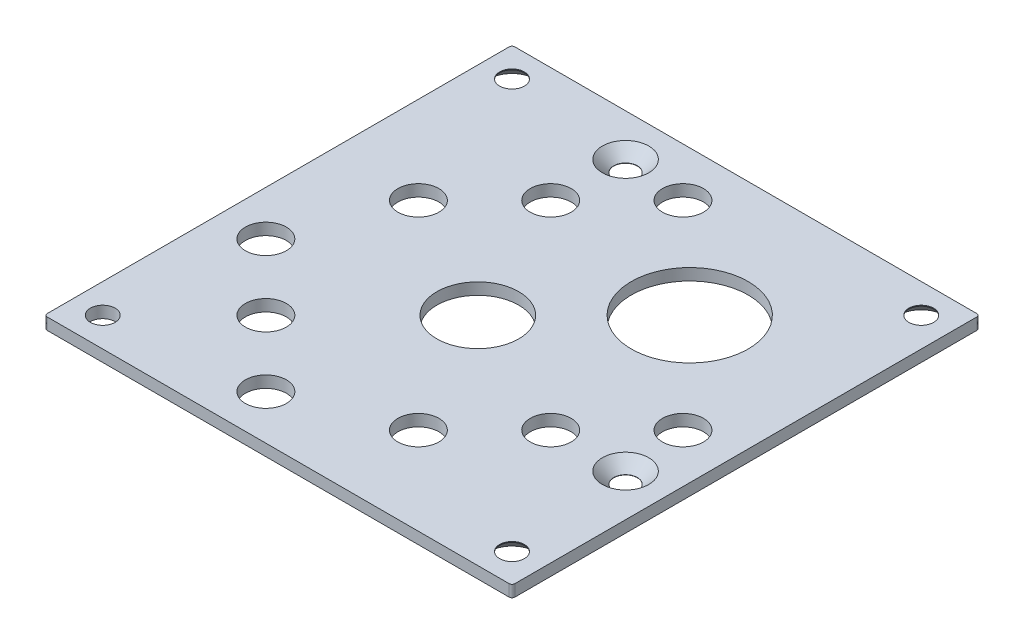
ISO-10303-21;
HEADER;
FILE_DESCRIPTION(('STEP AP214'),'2;1');
FILE_NAME('part.step','',(''),(''),'','','');
FILE_SCHEMA(('AUTOMOTIVE_DESIGN { 1 0 10303 214 1 1 1 1 }'));
ENDSEC;
DATA;
#1=APPLICATION_CONTEXT('core data for automotive mechanical design processes');
#2=APPLICATION_PROTOCOL_DEFINITION('international standard','automotive_design',2000,#1);
#3=PRODUCT_CONTEXT('',#1,'mechanical');
#4=PRODUCT('Part','Part','',(#3));
#5=PRODUCT_RELATED_PRODUCT_CATEGORY('part','',(#4));
#6=PRODUCT_DEFINITION_FORMATION('','',#4);
#7=PRODUCT_DEFINITION_CONTEXT('part definition',#1,'design');
#8=PRODUCT_DEFINITION('design','',#6,#7);
#9=PRODUCT_DEFINITION_SHAPE('','',#8);
#10=(LENGTH_UNIT() NAMED_UNIT(*) SI_UNIT(.MILLI.,.METRE.));
#11=(NAMED_UNIT(*) PLANE_ANGLE_UNIT() SI_UNIT($,.RADIAN.));
#12=(NAMED_UNIT(*) SI_UNIT($,.STERADIAN.) SOLID_ANGLE_UNIT());
#13=UNCERTAINTY_MEASURE_WITH_UNIT(LENGTH_MEASURE(1.E-05),#10,'distance_accuracy_value','');
#14=(GEOMETRIC_REPRESENTATION_CONTEXT(3) GLOBAL_UNCERTAINTY_ASSIGNED_CONTEXT((#13)) GLOBAL_UNIT_ASSIGNED_CONTEXT((#10,
#11,#12)) REPRESENTATION_CONTEXT('',''));
#15=CARTESIAN_POINT('',(0.,0.,0.));
#16=DIRECTION('',(0.,0.,1.));
#17=DIRECTION('',(1.,0.,0.));
#18=AXIS2_PLACEMENT_3D('',#15,#16,#17);
#19=CARTESIAN_POINT('',(76.3793482367758,0.,47.8960232997482));
#20=DIRECTION('',(0.,-1.,0.));
#21=DIRECTION('',(0.,0.,-1.));
#22=AXIS2_PLACEMENT_3D('',#19,#20,#21);
#23=CYLINDRICAL_SURFACE('',#22,0.793749999999989);
#24=CARTESIAN_POINT('',(76.3793482367758,0.,47.8960232997482));
#25=DIRECTION('',(0.,-1.,0.));
#26=DIRECTION('',(0.,0.,-1.));
#27=AXIS2_PLACEMENT_3D('',#24,#25,#26);
#28=CIRCLE('',#27,0.793749999999989);
#29=CARTESIAN_POINT('',(77.1730982367758,0.,47.8960232997482));
#30=VERTEX_POINT('',#29);
#31=CARTESIAN_POINT('',(76.3793482367758,0.,48.6897732997481));
#32=VERTEX_POINT('',#31);
#33=EDGE_CURVE('E104',#30,#32,#28,.T.);
#34=ORIENTED_EDGE('',*,*,#33,.T.);
#35=DIRECTION('',(0.,1.,0.));
#36=VECTOR('',#35,1.);
#37=CARTESIAN_POINT('',(76.3793482367758,0.,48.6897732997481));
#38=LINE('',#37,#36);
#39=CARTESIAN_POINT('',(76.3793482367758,-3.175,48.6897732997481));
#40=VERTEX_POINT('',#39);
#41=EDGE_CURVE('E139',#40,#32,#38,.T.);
#42=ORIENTED_EDGE('',*,*,#41,.F.);
#43=CARTESIAN_POINT('',(76.3793482367758,-3.175,47.8960232997482));
#44=DIRECTION('',(0.,-1.,0.));
#45=DIRECTION('',(0.,0.,-1.));
#46=AXIS2_PLACEMENT_3D('',#43,#44,#45);
#47=CIRCLE('',#46,0.793749999999989);
#48=CARTESIAN_POINT('',(77.1730982367758,-3.175,47.8960232997482));
#49=VERTEX_POINT('',#48);
#50=EDGE_CURVE('E39',#40,#49,#47,.F.);
#51=ORIENTED_EDGE('',*,*,#50,.T.);
#52=DIRECTION('',(0.,1.,0.));
#53=VECTOR('',#52,1.);
#54=CARTESIAN_POINT('',(77.1730982367758,0.,47.8960232997482));
#55=LINE('',#54,#53);
#56=EDGE_CURVE('E125',#30,#49,#55,.F.);
#57=ORIENTED_EDGE('',*,*,#56,.F.);
#58=EDGE_LOOP('',(#34,#42,#51,#57));
#59=FACE_BOUND('',#58,.T.);
#60=ADVANCED_FACE('F36',(#59),#23,.T.);
#61=CARTESIAN_POINT('',(-49.0331517632242,0.,47.8960232997481));
#62=DIRECTION('',(0.,-1.,0.));
#63=DIRECTION('',(0.,0.,-1.));
#64=AXIS2_PLACEMENT_3D('',#61,#62,#63);
#65=CYLINDRICAL_SURFACE('',#64,0.793750000000003);
#66=CARTESIAN_POINT('',(-49.0331517632242,0.,47.8960232997481));
#67=DIRECTION('',(0.,-1.,0.));
#68=DIRECTION('',(0.,0.,-1.));
#69=AXIS2_PLACEMENT_3D('',#66,#67,#68);
#70=CIRCLE('',#69,0.793750000000003);
#71=CARTESIAN_POINT('',(-49.0331517632242,0.,48.6897732997481));
#72=VERTEX_POINT('',#71);
#73=CARTESIAN_POINT('',(-49.8269017632242,0.,47.8960232997481));
#74=VERTEX_POINT('',#73);
#75=EDGE_CURVE('E224',#72,#74,#70,.T.);
#76=ORIENTED_EDGE('',*,*,#75,.T.);
#77=DIRECTION('',(0.,1.,0.));
#78=VECTOR('',#77,1.);
#79=CARTESIAN_POINT('',(-49.8269017632242,0.,47.8960232997481));
#80=LINE('',#79,#78);
#81=CARTESIAN_POINT('',(-49.8269017632242,-3.175,47.8960232997481));
#82=VERTEX_POINT('',#81);
#83=EDGE_CURVE('E147',#82,#74,#80,.T.);
#84=ORIENTED_EDGE('',*,*,#83,.F.);
#85=CARTESIAN_POINT('',(-49.0331517632242,-3.175,47.8960232997481));
#86=DIRECTION('',(0.,-1.,0.));
#87=DIRECTION('',(0.,0.,-1.));
#88=AXIS2_PLACEMENT_3D('',#85,#86,#87);
#89=CIRCLE('',#88,0.793750000000003);
#90=CARTESIAN_POINT('',(-49.0331517632242,-3.175,48.6897732997481));
#91=VERTEX_POINT('',#90);
#92=EDGE_CURVE('E227',#82,#91,#89,.F.);
#93=ORIENTED_EDGE('',*,*,#92,.T.);
#94=DIRECTION('',(0.,1.,0.));
#95=VECTOR('',#94,1.);
#96=CARTESIAN_POINT('',(-49.0331517632242,0.,48.6897732997481));
#97=LINE('',#96,#95);
#98=EDGE_CURVE('E136',#72,#91,#97,.F.);
#99=ORIENTED_EDGE('',*,*,#98,.F.);
#100=EDGE_LOOP('',(#76,#84,#93,#99));
#101=FACE_BOUND('',#100,.T.);
#102=ADVANCED_FACE('F258',(#101),#65,.T.);
#103=CARTESIAN_POINT('',(-49.0331517632242,0.,-77.5164767002519));
#104=DIRECTION('',(0.,-1.,0.));
#105=DIRECTION('',(0.,0.,-1.));
#106=AXIS2_PLACEMENT_3D('',#103,#104,#105);
#107=CYLINDRICAL_SURFACE('',#106,0.793749999999996);
#108=CARTESIAN_POINT('',(-49.0331517632242,0.,-77.5164767002519));
#109=DIRECTION('',(0.,-1.,0.));
#110=DIRECTION('',(0.,0.,-1.));
#111=AXIS2_PLACEMENT_3D('',#108,#109,#110);
#112=CIRCLE('',#111,0.793749999999996);
#113=CARTESIAN_POINT('',(-49.8269017632242,0.,-77.5164767002519));
#114=VERTEX_POINT('',#113);
#115=CARTESIAN_POINT('',(-49.0331517632242,0.,-78.3102267002519));
#116=VERTEX_POINT('',#115);
#117=EDGE_CURVE('E222',#114,#116,#112,.T.);
#118=ORIENTED_EDGE('',*,*,#117,.T.);
#119=DIRECTION('',(0.,1.,0.));
#120=VECTOR('',#119,1.);
#121=CARTESIAN_POINT('',(-49.0331517632242,0.,-78.3102267002519));
#122=LINE('',#121,#120);
#123=CARTESIAN_POINT('',(-49.0331517632242,-3.175,-78.3102267002519));
#124=VERTEX_POINT('',#123);
#125=EDGE_CURVE('E142',#124,#116,#122,.T.);
#126=ORIENTED_EDGE('',*,*,#125,.F.);
#127=CARTESIAN_POINT('',(-49.0331517632242,-3.175,-77.5164767002519));
#128=DIRECTION('',(0.,-1.,0.));
#129=DIRECTION('',(0.,0.,-1.));
#130=AXIS2_PLACEMENT_3D('',#127,#128,#129);
#131=CIRCLE('',#130,0.793749999999996);
#132=CARTESIAN_POINT('',(-49.8269017632242,-3.175,-77.5164767002519));
#133=VERTEX_POINT('',#132);
#134=EDGE_CURVE('E53',#124,#133,#131,.F.);
#135=ORIENTED_EDGE('',*,*,#134,.T.);
#136=DIRECTION('',(0.,1.,0.));
#137=VECTOR('',#136,1.);
#138=CARTESIAN_POINT('',(-49.8269017632242,0.,-77.5164767002519));
#139=LINE('',#138,#137);
#140=EDGE_CURVE('E146',#114,#133,#139,.F.);
#141=ORIENTED_EDGE('',*,*,#140,.F.);
#142=EDGE_LOOP('',(#118,#126,#135,#141));
#143=FACE_BOUND('',#142,.T.);
#144=ADVANCED_FACE('F266',(#143),#107,.T.);
#145=CARTESIAN_POINT('',(76.3793482367758,0.,-77.5164767002519));
#146=DIRECTION('',(0.,-1.,0.));
#147=DIRECTION('',(0.,0.,-1.));
#148=AXIS2_PLACEMENT_3D('',#145,#146,#147);
#149=PLANE('',#148);
#150=CARTESIAN_POINT('',(65.7430982367758,0.,6.42147017462234));
#151=DIRECTION('',(0.,1.,0.));
#152=DIRECTION('',(0.,0.,1.));
#153=AXIS2_PLACEMENT_3D('',#150,#151,#152);
#154=CIRCLE('',#153,6.3);
#155=CARTESIAN_POINT('',(65.7430982367758,0.,12.7214701746223));
#156=VERTEX_POINT('',#155);
#157=EDGE_CURVE('E410',#156,#156,#154,.T.);
#158=ORIENTED_EDGE('',*,*,#157,.F.);
#159=EDGE_LOOP('',(#158));
#160=FACE_BOUND('',#159,.T.);
#161=CARTESIAN_POINT('',(-7.55859863809813,0.,-66.8802267002519));
#162=DIRECTION('',(0.,1.,0.));
#163=DIRECTION('',(0.,0.,1.));
#164=AXIS2_PLACEMENT_3D('',#161,#162,#163);
#165=CIRCLE('',#164,6.3);
#166=CARTESIAN_POINT('',(-7.55859863809813,0.,-60.5802267002519));
#167=VERTEX_POINT('',#166);
#168=EDGE_CURVE('E419',#167,#167,#165,.T.);
#169=ORIENTED_EDGE('',*,*,#168,.F.);
#170=EDGE_LOOP('',(#169));
#171=FACE_BOUND('',#170,.T.);
#172=CARTESIAN_POINT('',(37.8030982367758,0.,-38.9402267002519));
#173=DIRECTION('',(0.,-1.,0.));
#174=DIRECTION('',(0.,0.,-1.));
#175=AXIS2_PLACEMENT_3D('',#172,#173,#174);
#176=CIRCLE('',#175,15.875);
#177=CARTESIAN_POINT('',(37.8030982367758,0.,-54.8152267002519));
#178=VERTEX_POINT('',#177);
#179=EDGE_CURVE('E232',#178,#178,#176,.F.);
#180=ORIENTED_EDGE('',*,*,#179,.F.);
#181=EDGE_LOOP('',(#180));
#182=FACE_BOUND('',#181,.T.);
#183=DIRECTION('',(-1.,0.,0.));
#184=VECTOR('',#183,1.);
#185=CARTESIAN_POINT('',(-49.0331517632242,0.,-78.3102267002519));
#186=LINE('',#185,#184);
#187=CARTESIAN_POINT('',(76.3793482367758,0.,-78.3102267002519));
#188=VERTEX_POINT('',#187);
#189=EDGE_CURVE('E140',#116,#188,#186,.F.);
#190=ORIENTED_EDGE('',*,*,#189,.F.);
#191=ORIENTED_EDGE('',*,*,#117,.F.);
#192=DIRECTION('',(0.,0.,1.));
#193=VECTOR('',#192,1.);
#194=CARTESIAN_POINT('',(-49.8269017632242,0.,47.8960232997481));
#195=LINE('',#194,#193);
#196=EDGE_CURVE('E143',#74,#114,#195,.F.);
#197=ORIENTED_EDGE('',*,*,#196,.F.);
#198=ORIENTED_EDGE('',*,*,#75,.F.);
#199=DIRECTION('',(1.,0.,0.));
#200=VECTOR('',#199,1.);
#201=CARTESIAN_POINT('',(76.3793482367758,0.,48.6897732997481));
#202=LINE('',#201,#200);
#203=EDGE_CURVE('E148',#32,#72,#202,.F.);
#204=ORIENTED_EDGE('',*,*,#203,.F.);
#205=ORIENTED_EDGE('',*,*,#33,.F.);
#206=DIRECTION('',(0.,0.,-1.));
#207=VECTOR('',#206,1.);
#208=CARTESIAN_POINT('',(77.1730982367758,0.,-77.5164767002519));
#209=LINE('',#208,#207);
#210=CARTESIAN_POINT('',(77.1730982367758,0.,-77.5164767002519));
#211=VERTEX_POINT('',#210);
#212=EDGE_CURVE('E121',#211,#30,#209,.F.);
#213=ORIENTED_EDGE('',*,*,#212,.F.);
#214=CARTESIAN_POINT('',(76.3793482367758,0.,-77.5164767002519));
#215=DIRECTION('',(0.,-1.,0.));
#216=DIRECTION('',(0.,0.,-1.));
#217=AXIS2_PLACEMENT_3D('',#214,#215,#216);
#218=CIRCLE('',#217,0.79375000000001);
#219=EDGE_CURVE('E109',#188,#211,#218,.T.);
#220=ORIENTED_EDGE('',*,*,#219,.F.);
#221=EDGE_LOOP('',(#190,#191,#197,#198,#204,#205,#213,#220));
#222=FACE_BOUND('',#221,.T.);
#223=CARTESIAN_POINT('',(9.86980299882452,0.,-65.0415496895075));
#224=DIRECTION('',(0.,-1.,0.));
#225=DIRECTION('',(0.,0.,-1.));
#226=AXIS2_PLACEMENT_3D('',#223,#224,#225);
#227=CIRCLE('',#226,5.56259999999954);
#228=CARTESIAN_POINT('',(9.86980299882452,0.,-70.6041496895071));
#229=VERTEX_POINT('',#228);
#230=EDGE_CURVE('E129',#229,#229,#227,.T.);
#231=ORIENTED_EDGE('',*,*,#230,.T.);
#232=EDGE_LOOP('',(#231));
#233=FACE_BOUND('',#232,.T.);
#234=CARTESIAN_POINT('',(27.9833967417508,0.,24.9140930219768));
#235=DIRECTION('',(0.,-1.,0.));
#236=DIRECTION('',(0.,0.,-1.));
#237=AXIS2_PLACEMENT_3D('',#234,#235,#236);
#238=CIRCLE('',#237,5.56260000000157);
#239=CARTESIAN_POINT('',(27.9833967417508,0.,19.3514930219753));
#240=VERTEX_POINT('',#239);
#241=EDGE_CURVE('E132',#240,#240,#238,.T.);
#242=ORIENTED_EDGE('',*,*,#241,.T.);
#243=EDGE_LOOP('',(#242));
#244=FACE_BOUND('',#243,.T.);
#245=CARTESIAN_POINT('',(-8.09070924331382,0.,-47.0810374473692));
#246=DIRECTION('',(0.,-1.,0.));
#247=DIRECTION('',(0.,0.,-1.));
#248=AXIS2_PLACEMENT_3D('',#245,#246,#247);
#249=CIRCLE('',#248,5.56259999999954);
#250=CARTESIAN_POINT('',(-8.09070924331382,0.,-52.6436374473688));
#251=VERTEX_POINT('',#250);
#252=EDGE_CURVE('E186',#251,#251,#249,.T.);
#253=ORIENTED_EDGE('',*,*,#252,.T.);
#254=EDGE_LOOP('',(#253));
#255=FACE_BOUND('',#254,.T.);
#256=CARTESIAN_POINT('',(-41.8894017632242,0.,-70.3727267002519));
#257=DIRECTION('',(0.,-1.,0.));
#258=DIRECTION('',(0.,0.,-1.));
#259=AXIS2_PLACEMENT_3D('',#256,#257,#258);
#260=CIRCLE('',#259,3.3528);
#261=CARTESIAN_POINT('',(-41.8894017632242,0.,-73.7255267002519));
#262=VERTEX_POINT('',#261);
#263=EDGE_CURVE('E189',#262,#262,#260,.T.);
#264=ORIENTED_EDGE('',*,*,#263,.T.);
#265=EDGE_LOOP('',(#264));
#266=FACE_BOUND('',#265,.T.);
#267=CARTESIAN_POINT('',(69.2355982367758,0.,40.7522732997481));
#268=DIRECTION('',(0.,-1.,0.));
#269=DIRECTION('',(0.,0.,-1.));
#270=AXIS2_PLACEMENT_3D('',#267,#268,#269);
#271=CIRCLE('',#270,3.3528);
#272=CARTESIAN_POINT('',(69.2355982367758,0.,37.3994732997481));
#273=VERTEX_POINT('',#272);
#274=EDGE_CURVE('E192',#273,#273,#271,.T.);
#275=ORIENTED_EDGE('',*,*,#274,.T.);
#276=EDGE_LOOP('',(#275));
#277=FACE_BOUND('',#276,.T.);
#278=CARTESIAN_POINT('',(69.2355982367759,0.,-70.3727267002519));
#279=DIRECTION('',(0.,-1.,0.));
#280=DIRECTION('',(0.,0.,-1.));
#281=AXIS2_PLACEMENT_3D('',#278,#279,#280);
#282=CIRCLE('',#281,3.3528);
#283=CARTESIAN_POINT('',(69.2355982367759,0.,-73.7255267002519));
#284=VERTEX_POINT('',#283);
#285=EDGE_CURVE('E195',#284,#284,#282,.T.);
#286=ORIENTED_EDGE('',*,*,#285,.T.);
#287=EDGE_LOOP('',(#286));
#288=FACE_BOUND('',#287,.T.);
#289=CARTESIAN_POINT('',(9.03035762487018,0.,-10.1674860883464));
#290=DIRECTION('',(0.,-1.,0.));
#291=DIRECTION('',(0.,0.,-1.));
#292=AXIS2_PLACEMENT_3D('',#289,#290,#291);
#293=CIRCLE('',#292,11.1125);
#294=CARTESIAN_POINT('',(9.03035762487018,0.,-21.2799860883464));
#295=VERTEX_POINT('',#294);
#296=EDGE_CURVE('E198',#295,#295,#293,.T.);
#297=ORIENTED_EDGE('',*,*,#296,.T.);
#298=EDGE_LOOP('',(#297));
#299=FACE_BOUND('',#298,.T.);
#300=CARTESIAN_POINT('',(-41.8894017632242,0.,40.7522732997481));
#301=DIRECTION('',(0.,-1.,0.));
#302=DIRECTION('',(0.,0.,-1.));
#303=AXIS2_PLACEMENT_3D('',#300,#301,#302);
#304=CIRCLE('',#303,3.3528);
#305=CARTESIAN_POINT('',(-41.8894017632242,0.,37.3994732997481));
#306=VERTEX_POINT('',#305);
#307=EDGE_CURVE('E201',#306,#306,#304,.T.);
#308=ORIENTED_EDGE('',*,*,#307,.T.);
#309=EDGE_LOOP('',(#308));
#310=FACE_BOUND('',#309,.T.);
#311=CARTESIAN_POINT('',(-26.0512214854522,0.,-29.120525205231));
#312=DIRECTION('',(0.,-1.,0.));
#313=DIRECTION('',(0.,0.,-1.));
#314=AXIS2_PLACEMENT_3D('',#311,#312,#313);
#315=CIRCLE('',#314,5.56259999999954);
#316=CARTESIAN_POINT('',(-26.0512214854522,0.,-34.6831252052305));
#317=VERTEX_POINT('',#316);
#318=EDGE_CURVE('E204',#317,#317,#315,.T.);
#319=ORIENTED_EDGE('',*,*,#318,.T.);
#320=EDGE_LOOP('',(#319));
#321=FACE_BOUND('',#320,.T.);
#322=CARTESIAN_POINT('',(63.904421226029,0.,-11.0069314622982));
#323=DIRECTION('',(0.,-1.,0.));
#324=DIRECTION('',(0.,0.,-1.));
#325=AXIS2_PLACEMENT_3D('',#322,#323,#324);
#326=CIRCLE('',#325,5.5626);
#327=CARTESIAN_POINT('',(63.904421226029,0.,-16.5695314622982));
#328=VERTEX_POINT('',#327);
#329=EDGE_CURVE('E207',#328,#328,#326,.T.);
#330=ORIENTED_EDGE('',*,*,#329,.T.);
#331=EDGE_LOOP('',(#330));
#332=FACE_BOUND('',#331,.T.);
#333=CARTESIAN_POINT('',(45.9439089838899,0.,6.95358077983932));
#334=DIRECTION('',(0.,-1.,0.));
#335=DIRECTION('',(0.,0.,-1.));
#336=AXIS2_PLACEMENT_3D('',#333,#334,#335);
#337=CIRCLE('',#336,5.56260000000102);
#338=CARTESIAN_POINT('',(45.9439089838899,0.,1.3909807798383));
#339=VERTEX_POINT('',#338);
#340=EDGE_CURVE('E210',#339,#339,#337,.T.);
#341=ORIENTED_EDGE('',*,*,#340,.T.);
#342=EDGE_LOOP('',(#341));
#343=FACE_BOUND('',#342,.T.);
#344=CARTESIAN_POINT('',(-19.7423829870354,0.,18.6052545235591));
#345=DIRECTION('',(0.,-1.,0.));
#346=DIRECTION('',(0.,0.,-1.));
#347=AXIS2_PLACEMENT_3D('',#344,#345,#346);
#348=CIRCLE('',#347,5.5626);
#349=CARTESIAN_POINT('',(-19.7423829870354,0.,13.0426545235591));
#350=VERTEX_POINT('',#349);
#351=EDGE_CURVE('E213',#350,#350,#348,.T.);
#352=ORIENTED_EDGE('',*,*,#351,.T.);
#353=EDGE_LOOP('',(#352));
#354=FACE_BOUND('',#353,.T.);
#355=CARTESIAN_POINT('',(-1.78187074489717,0.,36.5657667656975));
#356=DIRECTION('',(0.,-1.,0.));
#357=DIRECTION('',(0.,0.,-1.));
#358=AXIS2_PLACEMENT_3D('',#355,#356,#357);
#359=CIRCLE('',#358,5.56259999999999);
#360=CARTESIAN_POINT('',(-1.78187074489717,0.,31.0031667656975));
#361=VERTEX_POINT('',#360);
#362=EDGE_CURVE('E216',#361,#361,#359,.T.);
#363=ORIENTED_EDGE('',*,*,#362,.T.);
#364=EDGE_LOOP('',(#363));
#365=FACE_BOUND('',#364,.T.);
#366=CARTESIAN_POINT('',(-37.7028952291737,0.,0.644742281420776));
#367=DIRECTION('',(0.,-1.,0.));
#368=DIRECTION('',(0.,0.,-1.));
#369=AXIS2_PLACEMENT_3D('',#366,#367,#368);
#370=CIRCLE('',#369,5.56260000000001);
#371=CARTESIAN_POINT('',(-37.7028952291737,0.,-4.91785771857923));
#372=VERTEX_POINT('',#371);
#373=EDGE_CURVE('E118',#372,#372,#370,.T.);
#374=ORIENTED_EDGE('',*,*,#373,.T.);
#375=EDGE_LOOP('',(#374));
#376=FACE_BOUND('',#375,.T.);
#377=ADVANCED_FACE('F122',(#160,#171,#182,#222,#233,#244,#255,#266,#277,#288,#299,#310,#321,
#332,#343,#354,#365,#376),#149,.F.);
#378=CARTESIAN_POINT('',(76.3793482367758,0.,-77.5164767002519));
#379=DIRECTION('',(0.,-1.,0.));
#380=DIRECTION('',(0.,0.,-1.));
#381=AXIS2_PLACEMENT_3D('',#378,#379,#380);
#382=CYLINDRICAL_SURFACE('',#381,0.79375000000001);
#383=ORIENTED_EDGE('',*,*,#219,.T.);
#384=DIRECTION('',(0.,1.,0.));
#385=VECTOR('',#384,1.);
#386=CARTESIAN_POINT('',(77.1730982367758,0.,-77.5164767002519));
#387=LINE('',#386,#385);
#388=CARTESIAN_POINT('',(77.1730982367758,-3.175,-77.5164767002519));
#389=VERTEX_POINT('',#388);
#390=EDGE_CURVE('E112',#389,#211,#387,.T.);
#391=ORIENTED_EDGE('',*,*,#390,.F.);
#392=CARTESIAN_POINT('',(76.3793482367758,-3.175,-77.5164767002519));
#393=DIRECTION('',(0.,-1.,0.));
#394=DIRECTION('',(0.,0.,-1.));
#395=AXIS2_PLACEMENT_3D('',#392,#393,#394);
#396=CIRCLE('',#395,0.79375000000001);
#397=CARTESIAN_POINT('',(76.3793482367758,-3.175,-78.3102267002519));
#398=VERTEX_POINT('',#397);
#399=EDGE_CURVE('E79',#389,#398,#396,.F.);
#400=ORIENTED_EDGE('',*,*,#399,.T.);
#401=DIRECTION('',(0.,1.,0.));
#402=VECTOR('',#401,1.);
#403=CARTESIAN_POINT('',(76.3793482367758,0.,-78.3102267002519));
#404=LINE('',#403,#402);
#405=EDGE_CURVE('E115',#188,#398,#404,.F.);
#406=ORIENTED_EDGE('',*,*,#405,.F.);
#407=EDGE_LOOP('',(#383,#391,#400,#406));
#408=FACE_BOUND('',#407,.T.);
#409=ADVANCED_FACE('F110',(#408),#382,.T.);
#410=CARTESIAN_POINT('',(-37.7028952291737,0.,0.644742281420776));
#411=DIRECTION('',(0.,-1.,0.));
#412=DIRECTION('',(0.,0.,-1.));
#413=AXIS2_PLACEMENT_3D('',#410,#411,#412);
#414=CYLINDRICAL_SURFACE('',#413,5.56260000000001);
#415=CARTESIAN_POINT('',(-37.7028952291737,-3.175,0.644742281420776));
#416=DIRECTION('',(0.,-1.,0.));
#417=DIRECTION('',(0.,0.,-1.));
#418=AXIS2_PLACEMENT_3D('',#415,#416,#417);
#419=CIRCLE('',#418,5.56260000000001);
#420=CARTESIAN_POINT('',(-37.7028952291737,-3.175,-4.91785771857923));
#421=VERTEX_POINT('',#420);
#422=EDGE_CURVE('E181',#421,#421,#419,.F.);
#423=ORIENTED_EDGE('',*,*,#422,.F.);
#424=EDGE_LOOP('',(#423));
#425=FACE_BOUND('',#424,.T.);
#426=ORIENTED_EDGE('',*,*,#373,.F.);
#427=EDGE_LOOP('',(#426));
#428=FACE_BOUND('',#427,.T.);
#429=ADVANCED_FACE('F337',(#425,#428),#414,.F.);
#430=CARTESIAN_POINT('',(-1.78187074489717,0.,36.5657667656975));
#431=DIRECTION('',(0.,-1.,0.));
#432=DIRECTION('',(0.,0.,-1.));
#433=AXIS2_PLACEMENT_3D('',#430,#431,#432);
#434=CYLINDRICAL_SURFACE('',#433,5.56259999999999);
#435=CARTESIAN_POINT('',(-1.78187074489717,-3.175,36.5657667656975));
#436=DIRECTION('',(0.,-1.,0.));
#437=DIRECTION('',(0.,0.,-1.));
#438=AXIS2_PLACEMENT_3D('',#435,#436,#437);
#439=CIRCLE('',#438,5.56259999999999);
#440=CARTESIAN_POINT('',(-1.78187074489717,-3.175,31.0031667656975));
#441=VERTEX_POINT('',#440);
#442=EDGE_CURVE('E178',#441,#441,#439,.F.);
#443=ORIENTED_EDGE('',*,*,#442,.F.);
#444=EDGE_LOOP('',(#443));
#445=FACE_BOUND('',#444,.T.);
#446=ORIENTED_EDGE('',*,*,#362,.F.);
#447=EDGE_LOOP('',(#446));
#448=FACE_BOUND('',#447,.T.);
#449=ADVANCED_FACE('F333',(#445,#448),#434,.F.);
#450=CARTESIAN_POINT('',(-19.7423829870354,0.,18.6052545235591));
#451=DIRECTION('',(0.,-1.,0.));
#452=DIRECTION('',(0.,0.,-1.));
#453=AXIS2_PLACEMENT_3D('',#450,#451,#452);
#454=CYLINDRICAL_SURFACE('',#453,5.5626);
#455=CARTESIAN_POINT('',(-19.7423829870354,-3.175,18.6052545235591));
#456=DIRECTION('',(0.,-1.,0.));
#457=DIRECTION('',(0.,0.,-1.));
#458=AXIS2_PLACEMENT_3D('',#455,#456,#457);
#459=CIRCLE('',#458,5.5626);
#460=CARTESIAN_POINT('',(-19.7423829870354,-3.175,13.0426545235591));
#461=VERTEX_POINT('',#460);
#462=EDGE_CURVE('E175',#461,#461,#459,.F.);
#463=ORIENTED_EDGE('',*,*,#462,.F.);
#464=EDGE_LOOP('',(#463));
#465=FACE_BOUND('',#464,.T.);
#466=ORIENTED_EDGE('',*,*,#351,.F.);
#467=EDGE_LOOP('',(#466));
#468=FACE_BOUND('',#467,.T.);
#469=ADVANCED_FACE('F329',(#465,#468),#454,.F.);
#470=CARTESIAN_POINT('',(45.9439089838899,0.,6.95358077983932));
#471=DIRECTION('',(0.,-1.,0.));
#472=DIRECTION('',(0.,0.,-1.));
#473=AXIS2_PLACEMENT_3D('',#470,#471,#472);
#474=CYLINDRICAL_SURFACE('',#473,5.56260000000102);
#475=CARTESIAN_POINT('',(45.9439089838899,-3.175,6.95358077983932));
#476=DIRECTION('',(0.,-1.,0.));
#477=DIRECTION('',(0.,0.,-1.));
#478=AXIS2_PLACEMENT_3D('',#475,#476,#477);
#479=CIRCLE('',#478,5.56260000000102);
#480=CARTESIAN_POINT('',(45.9439089838899,-3.175,1.3909807798383));
#481=VERTEX_POINT('',#480);
#482=EDGE_CURVE('E172',#481,#481,#479,.F.);
#483=ORIENTED_EDGE('',*,*,#482,.F.);
#484=EDGE_LOOP('',(#483));
#485=FACE_BOUND('',#484,.T.);
#486=ORIENTED_EDGE('',*,*,#340,.F.);
#487=EDGE_LOOP('',(#486));
#488=FACE_BOUND('',#487,.T.);
#489=ADVANCED_FACE('F325',(#485,#488),#474,.F.);
#490=CARTESIAN_POINT('',(63.904421226029,0.,-11.0069314622982));
#491=DIRECTION('',(0.,-1.,0.));
#492=DIRECTION('',(0.,0.,-1.));
#493=AXIS2_PLACEMENT_3D('',#490,#491,#492);
#494=CYLINDRICAL_SURFACE('',#493,5.5626);
#495=CARTESIAN_POINT('',(63.904421226029,-3.175,-11.0069314622982));
#496=DIRECTION('',(0.,-1.,0.));
#497=DIRECTION('',(0.,0.,-1.));
#498=AXIS2_PLACEMENT_3D('',#495,#496,#497);
#499=CIRCLE('',#498,5.5626);
#500=CARTESIAN_POINT('',(63.904421226029,-3.175,-16.5695314622982));
#501=VERTEX_POINT('',#500);
#502=EDGE_CURVE('E169',#501,#501,#499,.F.);
#503=ORIENTED_EDGE('',*,*,#502,.F.);
#504=EDGE_LOOP('',(#503));
#505=FACE_BOUND('',#504,.T.);
#506=ORIENTED_EDGE('',*,*,#329,.F.);
#507=EDGE_LOOP('',(#506));
#508=FACE_BOUND('',#507,.T.);
#509=ADVANCED_FACE('F321',(#505,#508),#494,.F.);
#510=CARTESIAN_POINT('',(-26.0512214854522,0.,-29.120525205231));
#511=DIRECTION('',(0.,-1.,0.));
#512=DIRECTION('',(0.,0.,-1.));
#513=AXIS2_PLACEMENT_3D('',#510,#511,#512);
#514=CYLINDRICAL_SURFACE('',#513,5.56259999999954);
#515=CARTESIAN_POINT('',(-26.0512214854522,-3.175,-29.120525205231));
#516=DIRECTION('',(0.,-1.,0.));
#517=DIRECTION('',(0.,0.,-1.));
#518=AXIS2_PLACEMENT_3D('',#515,#516,#517);
#519=CIRCLE('',#518,5.56259999999954);
#520=CARTESIAN_POINT('',(-26.0512214854522,-3.175,-34.6831252052305));
#521=VERTEX_POINT('',#520);
#522=EDGE_CURVE('E166',#521,#521,#519,.F.);
#523=ORIENTED_EDGE('',*,*,#522,.F.);
#524=EDGE_LOOP('',(#523));
#525=FACE_BOUND('',#524,.T.);
#526=ORIENTED_EDGE('',*,*,#318,.F.);
#527=EDGE_LOOP('',(#526));
#528=FACE_BOUND('',#527,.T.);
#529=ADVANCED_FACE('F317',(#525,#528),#514,.F.);
#530=CARTESIAN_POINT('',(-41.8894017632242,0.,40.7522732997481));
#531=DIRECTION('',(0.,-1.,0.));
#532=DIRECTION('',(0.,0.,-1.));
#533=AXIS2_PLACEMENT_3D('',#530,#531,#532);
#534=CYLINDRICAL_SURFACE('',#533,3.3528);
#535=CARTESIAN_POINT('',(-41.8894017632242,-3.175,40.7522732997481));
#536=DIRECTION('',(0.,-1.,0.));
#537=DIRECTION('',(0.,0.,-1.));
#538=AXIS2_PLACEMENT_3D('',#535,#536,#537);
#539=CIRCLE('',#538,3.3528);
#540=CARTESIAN_POINT('',(-41.8894017632242,-3.175,37.3994732997481));
#541=VERTEX_POINT('',#540);
#542=EDGE_CURVE('E163',#541,#541,#539,.F.);
#543=ORIENTED_EDGE('',*,*,#542,.F.);
#544=EDGE_LOOP('',(#543));
#545=FACE_BOUND('',#544,.T.);
#546=ORIENTED_EDGE('',*,*,#307,.F.);
#547=EDGE_LOOP('',(#546));
#548=FACE_BOUND('',#547,.T.);
#549=ADVANCED_FACE('F313',(#545,#548),#534,.F.);
#550=CARTESIAN_POINT('',(9.03035762487018,0.,-10.1674860883464));
#551=DIRECTION('',(0.,-1.,0.));
#552=DIRECTION('',(0.,0.,-1.));
#553=AXIS2_PLACEMENT_3D('',#550,#551,#552);
#554=CYLINDRICAL_SURFACE('',#553,11.1125);
#555=CARTESIAN_POINT('',(9.03035762487018,-3.175,-10.1674860883464));
#556=DIRECTION('',(0.,-1.,0.));
#557=DIRECTION('',(0.,0.,-1.));
#558=AXIS2_PLACEMENT_3D('',#555,#556,#557);
#559=CIRCLE('',#558,11.1125);
#560=CARTESIAN_POINT('',(9.03035762487018,-3.175,-21.2799860883464));
#561=VERTEX_POINT('',#560);
#562=EDGE_CURVE('E160',#561,#561,#559,.F.);
#563=ORIENTED_EDGE('',*,*,#562,.F.);
#564=EDGE_LOOP('',(#563));
#565=FACE_BOUND('',#564,.T.);
#566=ORIENTED_EDGE('',*,*,#296,.F.);
#567=EDGE_LOOP('',(#566));
#568=FACE_BOUND('',#567,.T.);
#569=ADVANCED_FACE('F309',(#565,#568),#554,.F.);
#570=CARTESIAN_POINT('',(69.2355982367759,0.,-70.3727267002519));
#571=DIRECTION('',(0.,-1.,0.));
#572=DIRECTION('',(0.,0.,-1.));
#573=AXIS2_PLACEMENT_3D('',#570,#571,#572);
#574=CYLINDRICAL_SURFACE('',#573,3.3528);
#575=CARTESIAN_POINT('',(69.2355982367759,-0.227800000000009,-70.3727267002519));
#576=DIRECTION('',(0.,-1.,0.));
#577=DIRECTION('',(0.,0.,-1.));
#578=AXIS2_PLACEMENT_3D('',#575,#576,#577);
#579=CIRCLE('',#578,3.3528);
#580=CARTESIAN_POINT('',(69.2355982367759,-0.227800000000009,-73.7255267002519));
#581=VERTEX_POINT('',#580);
#582=EDGE_CURVE('E398',#581,#581,#579,.T.);
#583=ORIENTED_EDGE('',*,*,#582,.T.);
#584=EDGE_LOOP('',(#583));
#585=FACE_BOUND('',#584,.T.);
#586=ORIENTED_EDGE('',*,*,#285,.F.);
#587=EDGE_LOOP('',(#586));
#588=FACE_BOUND('',#587,.T.);
#589=ADVANCED_FACE('F305',(#585,#588),#574,.F.);
#590=CARTESIAN_POINT('',(69.2355982367758,0.,40.7522732997481));
#591=DIRECTION('',(0.,-1.,0.));
#592=DIRECTION('',(0.,0.,-1.));
#593=AXIS2_PLACEMENT_3D('',#590,#591,#592);
#594=CYLINDRICAL_SURFACE('',#593,3.3528);
#595=CARTESIAN_POINT('',(69.2355982367758,-0.227800000000009,40.7522732997481));
#596=DIRECTION('',(0.,-1.,0.));
#597=DIRECTION('',(0.,0.,-1.));
#598=AXIS2_PLACEMENT_3D('',#595,#596,#597);
#599=CIRCLE('',#598,3.3528);
#600=CARTESIAN_POINT('',(69.2355982367758,-0.227800000000009,37.3994732997481));
#601=VERTEX_POINT('',#600);
#602=EDGE_CURVE('E407',#601,#601,#599,.T.);
#603=ORIENTED_EDGE('',*,*,#602,.T.);
#604=EDGE_LOOP('',(#603));
#605=FACE_BOUND('',#604,.T.);
#606=ORIENTED_EDGE('',*,*,#274,.F.);
#607=EDGE_LOOP('',(#606));
#608=FACE_BOUND('',#607,.T.);
#609=ADVANCED_FACE('F301',(#605,#608),#594,.F.);
#610=CARTESIAN_POINT('',(-41.8894017632242,0.,-70.3727267002519));
#611=DIRECTION('',(0.,-1.,0.));
#612=DIRECTION('',(0.,0.,-1.));
#613=AXIS2_PLACEMENT_3D('',#610,#611,#612);
#614=CYLINDRICAL_SURFACE('',#613,3.3528);
#615=CARTESIAN_POINT('',(-41.8894017632242,-0.227800000000002,-70.3727267002519));
#616=DIRECTION('',(0.,-1.,0.));
#617=DIRECTION('',(0.,0.,-1.));
#618=AXIS2_PLACEMENT_3D('',#615,#616,#617);
#619=CIRCLE('',#618,3.3528);
#620=CARTESIAN_POINT('',(-41.8894017632242,-0.227800000000002,-73.7255267002519));
#621=VERTEX_POINT('',#620);
#622=EDGE_CURVE('E394',#621,#621,#619,.T.);
#623=ORIENTED_EDGE('',*,*,#622,.T.);
#624=EDGE_LOOP('',(#623));
#625=FACE_BOUND('',#624,.T.);
#626=ORIENTED_EDGE('',*,*,#263,.F.);
#627=EDGE_LOOP('',(#626));
#628=FACE_BOUND('',#627,.T.);
#629=ADVANCED_FACE('F297',(#625,#628),#614,.F.);
#630=CARTESIAN_POINT('',(-8.09070924331382,0.,-47.0810374473692));
#631=DIRECTION('',(0.,-1.,0.));
#632=DIRECTION('',(0.,0.,-1.));
#633=AXIS2_PLACEMENT_3D('',#630,#631,#632);
#634=CYLINDRICAL_SURFACE('',#633,5.56259999999954);
#635=CARTESIAN_POINT('',(-8.09070924331382,-3.175,-47.0810374473692));
#636=DIRECTION('',(0.,-1.,0.));
#637=DIRECTION('',(0.,0.,-1.));
#638=AXIS2_PLACEMENT_3D('',#635,#636,#637);
#639=CIRCLE('',#638,5.56259999999954);
#640=CARTESIAN_POINT('',(-8.09070924331382,-3.175,-52.6436374473688));
#641=VERTEX_POINT('',#640);
#642=EDGE_CURVE('E157',#641,#641,#639,.F.);
#643=ORIENTED_EDGE('',*,*,#642,.F.);
#644=EDGE_LOOP('',(#643));
#645=FACE_BOUND('',#644,.T.);
#646=ORIENTED_EDGE('',*,*,#252,.F.);
#647=EDGE_LOOP('',(#646));
#648=FACE_BOUND('',#647,.T.);
#649=ADVANCED_FACE('F293',(#645,#648),#634,.F.);
#650=CARTESIAN_POINT('',(27.9833967417508,0.,24.9140930219768));
#651=DIRECTION('',(0.,-1.,0.));
#652=DIRECTION('',(0.,0.,-1.));
#653=AXIS2_PLACEMENT_3D('',#650,#651,#652);
#654=CYLINDRICAL_SURFACE('',#653,5.56260000000157);
#655=CARTESIAN_POINT('',(27.9833967417508,-3.175,24.9140930219768));
#656=DIRECTION('',(0.,-1.,0.));
#657=DIRECTION('',(0.,0.,-1.));
#658=AXIS2_PLACEMENT_3D('',#655,#656,#657);
#659=CIRCLE('',#658,5.56260000000157);
#660=CARTESIAN_POINT('',(27.9833967417508,-3.175,19.3514930219753));
#661=VERTEX_POINT('',#660);
#662=EDGE_CURVE('E154',#661,#661,#659,.F.);
#663=ORIENTED_EDGE('',*,*,#662,.F.);
#664=EDGE_LOOP('',(#663));
#665=FACE_BOUND('',#664,.T.);
#666=ORIENTED_EDGE('',*,*,#241,.F.);
#667=EDGE_LOOP('',(#666));
#668=FACE_BOUND('',#667,.T.);
#669=ADVANCED_FACE('F289',(#665,#668),#654,.F.);
#670=CARTESIAN_POINT('',(9.86980299882452,0.,-65.0415496895075));
#671=DIRECTION('',(0.,-1.,0.));
#672=DIRECTION('',(0.,0.,-1.));
#673=AXIS2_PLACEMENT_3D('',#670,#671,#672);
#674=CYLINDRICAL_SURFACE('',#673,5.56259999999954);
#675=CARTESIAN_POINT('',(9.86980299882452,-3.175,-65.0415496895075));
#676=DIRECTION('',(0.,-1.,0.));
#677=DIRECTION('',(0.,0.,-1.));
#678=AXIS2_PLACEMENT_3D('',#675,#676,#677);
#679=CIRCLE('',#678,5.56259999999954);
#680=CARTESIAN_POINT('',(9.86980299882452,-3.175,-70.6041496895071));
#681=VERTEX_POINT('',#680);
#682=EDGE_CURVE('E151',#681,#681,#679,.F.);
#683=ORIENTED_EDGE('',*,*,#682,.F.);
#684=EDGE_LOOP('',(#683));
#685=FACE_BOUND('',#684,.T.);
#686=ORIENTED_EDGE('',*,*,#230,.F.);
#687=EDGE_LOOP('',(#686));
#688=FACE_BOUND('',#687,.T.);
#689=ADVANCED_FACE('F286',(#685,#688),#674,.F.);
#690=CARTESIAN_POINT('',(77.1730982367758,0.,-77.5164767002519));
#691=DIRECTION('',(1.,0.,0.));
#692=DIRECTION('',(0.,0.,-1.));
#693=AXIS2_PLACEMENT_3D('',#690,#691,#692);
#694=PLANE('',#693);
#695=ORIENTED_EDGE('',*,*,#212,.T.);
#696=ORIENTED_EDGE('',*,*,#56,.T.);
#697=DIRECTION('',(0.,0.,-1.));
#698=VECTOR('',#697,1.);
#699=CARTESIAN_POINT('',(77.1730982367758,-3.175,-77.5164767002519));
#700=LINE('',#699,#698);
#701=EDGE_CURVE('E128',#389,#49,#700,.F.);
#702=ORIENTED_EDGE('',*,*,#701,.F.);
#703=ORIENTED_EDGE('',*,*,#390,.T.);
#704=EDGE_LOOP('',(#695,#696,#702,#703));
#705=FACE_BOUND('',#704,.T.);
#706=ADVANCED_FACE('F127',(#705),#694,.T.);
#707=CARTESIAN_POINT('',(76.3793482367758,0.,48.6897732997481));
#708=DIRECTION('',(0.,0.,1.));
#709=DIRECTION('',(1.,0.,0.));
#710=AXIS2_PLACEMENT_3D('',#707,#708,#709);
#711=PLANE('',#710);
#712=ORIENTED_EDGE('',*,*,#203,.T.);
#713=ORIENTED_EDGE('',*,*,#98,.T.);
#714=DIRECTION('',(1.,0.,0.));
#715=VECTOR('',#714,1.);
#716=CARTESIAN_POINT('',(76.3793482367758,-3.175,48.6897732997481));
#717=LINE('',#716,#715);
#718=EDGE_CURVE('E244',#40,#91,#717,.F.);
#719=ORIENTED_EDGE('',*,*,#718,.F.);
#720=ORIENTED_EDGE('',*,*,#41,.T.);
#721=EDGE_LOOP('',(#712,#713,#719,#720));
#722=FACE_BOUND('',#721,.T.);
#723=ADVANCED_FACE('F256',(#722),#711,.T.);
#724=CARTESIAN_POINT('',(-49.8269017632242,0.,47.8960232997481));
#725=DIRECTION('',(-1.,0.,0.));
#726=DIRECTION('',(0.,0.,1.));
#727=AXIS2_PLACEMENT_3D('',#724,#725,#726);
#728=PLANE('',#727);
#729=ORIENTED_EDGE('',*,*,#196,.T.);
#730=ORIENTED_EDGE('',*,*,#140,.T.);
#731=DIRECTION('',(0.,0.,-1.));
#732=VECTOR('',#731,1.);
#733=CARTESIAN_POINT('',(-49.8269017632242,-3.175,-77.5164767002519));
#734=LINE('',#733,#732);
#735=EDGE_CURVE('E45',#82,#133,#734,.T.);
#736=ORIENTED_EDGE('',*,*,#735,.F.);
#737=ORIENTED_EDGE('',*,*,#83,.T.);
#738=EDGE_LOOP('',(#729,#730,#736,#737));
#739=FACE_BOUND('',#738,.T.);
#740=ADVANCED_FACE('F263',(#739),#728,.T.);
#741=CARTESIAN_POINT('',(-49.0331517632242,0.,-78.3102267002519));
#742=DIRECTION('',(0.,0.,-1.));
#743=DIRECTION('',(-1.,0.,0.));
#744=AXIS2_PLACEMENT_3D('',#741,#742,#743);
#745=PLANE('',#744);
#746=ORIENTED_EDGE('',*,*,#189,.T.);
#747=ORIENTED_EDGE('',*,*,#405,.T.);
#748=DIRECTION('',(1.,0.,0.));
#749=VECTOR('',#748,1.);
#750=CARTESIAN_POINT('',(76.3793482367758,-3.175,-78.3102267002519));
#751=LINE('',#750,#749);
#752=EDGE_CURVE('E11',#124,#398,#751,.T.);
#753=ORIENTED_EDGE('',*,*,#752,.F.);
#754=ORIENTED_EDGE('',*,*,#125,.T.);
#755=EDGE_LOOP('',(#746,#747,#753,#754));
#756=FACE_BOUND('',#755,.T.);
#757=ADVANCED_FACE('F269',(#756),#745,.T.);
#758=CARTESIAN_POINT('',(76.3793482367758,-3.175,-77.5164767002519));
#759=DIRECTION('',(0.,-1.,0.));
#760=DIRECTION('',(0.,0.,-1.));
#761=AXIS2_PLACEMENT_3D('',#758,#759,#760);
#762=PLANE('',#761);
#763=CARTESIAN_POINT('',(-41.8894017632242,-3.175,-70.3727267002519));
#764=DIRECTION('',(0.,-1.,0.));
#765=DIRECTION('',(0.,0.,-1.));
#766=AXIS2_PLACEMENT_3D('',#763,#764,#765);
#767=CIRCLE('',#766,6.3);
#768=CARTESIAN_POINT('',(-41.8894017632242,-3.175,-76.6727267002519));
#769=VERTEX_POINT('',#768);
#770=EDGE_CURVE('E391',#769,#769,#767,.T.);
#771=ORIENTED_EDGE('',*,*,#770,.F.);
#772=EDGE_LOOP('',(#771));
#773=FACE_BOUND('',#772,.T.);
#774=CARTESIAN_POINT('',(69.2355982367759,-3.175,-70.3727267002519));
#775=DIRECTION('',(0.,-1.,0.));
#776=DIRECTION('',(0.,0.,-1.));
#777=AXIS2_PLACEMENT_3D('',#774,#775,#776);
#778=CIRCLE('',#777,6.3);
#779=CARTESIAN_POINT('',(69.2355982367759,-3.175,-76.6727267002519));
#780=VERTEX_POINT('',#779);
#781=EDGE_CURVE('E395',#780,#780,#778,.T.);
#782=ORIENTED_EDGE('',*,*,#781,.F.);
#783=EDGE_LOOP('',(#782));
#784=FACE_BOUND('',#783,.T.);
#785=CARTESIAN_POINT('',(69.2355982367758,-3.175,40.7522732997481));
#786=DIRECTION('',(0.,-1.,0.));
#787=DIRECTION('',(0.,0.,-1.));
#788=AXIS2_PLACEMENT_3D('',#785,#786,#787);
#789=CIRCLE('',#788,6.3);
#790=CARTESIAN_POINT('',(69.2355982367758,-3.175,34.4522732997481));
#791=VERTEX_POINT('',#790);
#792=EDGE_CURVE('E404',#791,#791,#789,.T.);
#793=ORIENTED_EDGE('',*,*,#792,.F.);
#794=EDGE_LOOP('',(#793));
#795=FACE_BOUND('',#794,.T.);
#796=CARTESIAN_POINT('',(65.7430982367758,-3.175,6.42147017462234));
#797=DIRECTION('',(0.,1.,0.));
#798=DIRECTION('',(0.,0.,1.));
#799=AXIS2_PLACEMENT_3D('',#796,#797,#798);
#800=CIRCLE('',#799,3.19999999999999);
#801=CARTESIAN_POINT('',(65.7430982367758,-3.175,9.62147017462234));
#802=VERTEX_POINT('',#801);
#803=EDGE_CURVE('E416',#802,#802,#800,.T.);
#804=ORIENTED_EDGE('',*,*,#803,.T.);
#805=EDGE_LOOP('',(#804));
#806=FACE_BOUND('',#805,.T.);
#807=CARTESIAN_POINT('',(-7.55859863809813,-3.175,-66.8802267002519));
#808=DIRECTION('',(0.,1.,0.));
#809=DIRECTION('',(0.,0.,1.));
#810=AXIS2_PLACEMENT_3D('',#807,#808,#809);
#811=CIRCLE('',#810,3.2);
#812=CARTESIAN_POINT('',(-7.55859863809813,-3.175,-63.6802267002519));
#813=VERTEX_POINT('',#812);
#814=EDGE_CURVE('E239',#813,#813,#811,.T.);
#815=ORIENTED_EDGE('',*,*,#814,.T.);
#816=EDGE_LOOP('',(#815));
#817=FACE_BOUND('',#816,.T.);
#818=CARTESIAN_POINT('',(37.8030982367758,-3.175,-38.9402267002519));
#819=DIRECTION('',(0.,-1.,0.));
#820=DIRECTION('',(0.,0.,-1.));
#821=AXIS2_PLACEMENT_3D('',#818,#819,#820);
#822=CIRCLE('',#821,15.875);
#823=CARTESIAN_POINT('',(37.8030982367758,-3.175,-54.8152267002519));
#824=VERTEX_POINT('',#823);
#825=EDGE_CURVE('E234',#824,#824,#822,.T.);
#826=ORIENTED_EDGE('',*,*,#825,.F.);
#827=EDGE_LOOP('',(#826));
#828=FACE_BOUND('',#827,.T.);
#829=ORIENTED_EDGE('',*,*,#134,.F.);
#830=ORIENTED_EDGE('',*,*,#752,.T.);
#831=ORIENTED_EDGE('',*,*,#399,.F.);
#832=ORIENTED_EDGE('',*,*,#701,.T.);
#833=ORIENTED_EDGE('',*,*,#50,.F.);
#834=ORIENTED_EDGE('',*,*,#718,.T.);
#835=ORIENTED_EDGE('',*,*,#92,.F.);
#836=ORIENTED_EDGE('',*,*,#735,.T.);
#837=EDGE_LOOP('',(#829,#830,#831,#832,#833,#834,#835,#836));
#838=FACE_BOUND('',#837,.T.);
#839=ORIENTED_EDGE('',*,*,#682,.T.);
#840=EDGE_LOOP('',(#839));
#841=FACE_BOUND('',#840,.T.);
#842=ORIENTED_EDGE('',*,*,#662,.T.);
#843=EDGE_LOOP('',(#842));
#844=FACE_BOUND('',#843,.T.);
#845=ORIENTED_EDGE('',*,*,#642,.T.);
#846=EDGE_LOOP('',(#845));
#847=FACE_BOUND('',#846,.T.);
#848=ORIENTED_EDGE('',*,*,#562,.T.);
#849=EDGE_LOOP('',(#848));
#850=FACE_BOUND('',#849,.T.);
#851=ORIENTED_EDGE('',*,*,#542,.T.);
#852=EDGE_LOOP('',(#851));
#853=FACE_BOUND('',#852,.T.);
#854=ORIENTED_EDGE('',*,*,#522,.T.);
#855=EDGE_LOOP('',(#854));
#856=FACE_BOUND('',#855,.T.);
#857=ORIENTED_EDGE('',*,*,#502,.T.);
#858=EDGE_LOOP('',(#857));
#859=FACE_BOUND('',#858,.T.);
#860=ORIENTED_EDGE('',*,*,#482,.T.);
#861=EDGE_LOOP('',(#860));
#862=FACE_BOUND('',#861,.T.);
#863=ORIENTED_EDGE('',*,*,#462,.T.);
#864=EDGE_LOOP('',(#863));
#865=FACE_BOUND('',#864,.T.);
#866=ORIENTED_EDGE('',*,*,#442,.T.);
#867=EDGE_LOOP('',(#866));
#868=FACE_BOUND('',#867,.T.);
#869=ORIENTED_EDGE('',*,*,#422,.T.);
#870=EDGE_LOOP('',(#869));
#871=FACE_BOUND('',#870,.T.);
#872=ADVANCED_FACE('F259',(#773,#784,#795,#806,#817,#828,#838,#841,#844,#847,#850,#853,#856,
#859,#862,#865,#868,#871),#762,.T.);
#873=CARTESIAN_POINT('',(37.8030982367758,0.001000000000001,-38.9402267002519));
#874=DIRECTION('',(0.,-1.,0.));
#875=DIRECTION('',(0.,0.,-1.));
#876=AXIS2_PLACEMENT_3D('',#873,#874,#875);
#877=CYLINDRICAL_SURFACE('',#876,15.875);
#878=CARTESIAN_POINT('',(37.8030982367758,-3.175,-54.8152267002519));
#879=CARTESIAN_POINT('',(37.8030982367758,-3.14192708333333,-54.8152267002519));
#880=CARTESIAN_POINT('',(37.8030982367758,-3.10885416666667,-54.8152267002519));
#881=CARTESIAN_POINT('',(37.8030982367758,-3.04270833333333,-54.8152267002519));
#882=CARTESIAN_POINT('',(37.8030982367758,-3.00963541666667,-54.8152267002519));
#883=CARTESIAN_POINT('',(37.8030982367758,-2.94348958333333,-54.8152267002519));
#884=CARTESIAN_POINT('',(37.8030982367758,-2.91041666666667,-54.8152267002519));
#885=CARTESIAN_POINT('',(37.8030982367758,-2.84427083333333,-54.8152267002519));
#886=CARTESIAN_POINT('',(37.8030982367758,-2.81119791666667,-54.8152267002519));
#887=CARTESIAN_POINT('',(37.8030982367758,-2.74505208333333,-54.8152267002519));
#888=CARTESIAN_POINT('',(37.8030982367758,-2.71197916666667,-54.8152267002519));
#889=CARTESIAN_POINT('',(37.8030982367758,-2.64583333333333,-54.8152267002519));
#890=CARTESIAN_POINT('',(37.8030982367758,-2.61276041666667,-54.8152267002519));
#891=CARTESIAN_POINT('',(37.8030982367758,-2.54661458333333,-54.8152267002519));
#892=CARTESIAN_POINT('',(37.8030982367758,-2.51354166666667,-54.8152267002519));
#893=CARTESIAN_POINT('',(37.8030982367758,-2.44739583333333,-54.8152267002519));
#894=CARTESIAN_POINT('',(37.8030982367758,-2.41432291666667,-54.8152267002519));
#895=CARTESIAN_POINT('',(37.8030982367758,-2.34817708333333,-54.8152267002519));
#896=CARTESIAN_POINT('',(37.8030982367758,-2.31510416666667,-54.8152267002519));
#897=CARTESIAN_POINT('',(37.8030982367758,-2.24895833333333,-54.8152267002519));
#898=CARTESIAN_POINT('',(37.8030982367758,-2.21588541666667,-54.8152267002519));
#899=CARTESIAN_POINT('',(37.8030982367758,-2.14973958333333,-54.8152267002519));
#900=CARTESIAN_POINT('',(37.8030982367758,-2.11666666666667,-54.8152267002519));
#901=CARTESIAN_POINT('',(37.8030982367758,-2.05052083333333,-54.8152267002519));
#902=CARTESIAN_POINT('',(37.8030982367758,-2.01744791666667,-54.8152267002519));
#903=CARTESIAN_POINT('',(37.8030982367758,-1.95130208333333,-54.8152267002519));
#904=CARTESIAN_POINT('',(37.8030982367758,-1.91822916666667,-54.8152267002519));
#905=CARTESIAN_POINT('',(37.8030982367758,-1.85208333333333,-54.8152267002519));
#906=CARTESIAN_POINT('',(37.8030982367758,-1.81901041666667,-54.8152267002519));
#907=CARTESIAN_POINT('',(37.8030982367758,-1.75286458333333,-54.8152267002519));
#908=CARTESIAN_POINT('',(37.8030982367758,-1.71979166666667,-54.8152267002519));
#909=CARTESIAN_POINT('',(37.8030982367758,-1.65364583333333,-54.8152267002519));
#910=CARTESIAN_POINT('',(37.8030982367758,-1.62057291666667,-54.8152267002519));
#911=CARTESIAN_POINT('',(37.8030982367758,-1.55442708333333,-54.8152267002519));
#912=CARTESIAN_POINT('',(37.8030982367758,-1.52135416666667,-54.8152267002519));
#913=CARTESIAN_POINT('',(37.8030982367758,-1.45520833333333,-54.8152267002519));
#914=CARTESIAN_POINT('',(37.8030982367758,-1.42213541666667,-54.8152267002519));
#915=CARTESIAN_POINT('',(37.8030982367758,-1.35598958333333,-54.8152267002519));
#916=CARTESIAN_POINT('',(37.8030982367758,-1.32291666666667,-54.8152267002519));
#917=CARTESIAN_POINT('',(37.8030982367758,-1.25677083333333,-54.8152267002519));
#918=CARTESIAN_POINT('',(37.8030982367758,-1.22369791666667,-54.8152267002519));
#919=CARTESIAN_POINT('',(37.8030982367758,-1.15755208333333,-54.8152267002519));
#920=CARTESIAN_POINT('',(37.8030982367758,-1.12447916666667,-54.8152267002519));
#921=CARTESIAN_POINT('',(37.8030982367758,-1.05833333333333,-54.8152267002519));
#922=CARTESIAN_POINT('',(37.8030982367758,-1.02526041666667,-54.8152267002519));
#923=CARTESIAN_POINT('',(37.8030982367758,-0.959114583333332,-54.8152267002519));
#924=CARTESIAN_POINT('',(37.8030982367758,-0.926041666666666,-54.8152267002519));
#925=CARTESIAN_POINT('',(37.8030982367758,-0.859895833333333,-54.8152267002519));
#926=CARTESIAN_POINT('',(37.8030982367758,-0.826822916666666,-54.8152267002519));
#927=CARTESIAN_POINT('',(37.8030982367758,-0.760677083333333,-54.8152267002519));
#928=CARTESIAN_POINT('',(37.8030982367758,-0.727604166666666,-54.8152267002519));
#929=CARTESIAN_POINT('',(37.8030982367758,-0.661458333333333,-54.8152267002519));
#930=CARTESIAN_POINT('',(37.8030982367758,-0.628385416666666,-54.8152267002519));
#931=CARTESIAN_POINT('',(37.8030982367758,-0.562239583333333,-54.8152267002519));
#932=CARTESIAN_POINT('',(37.8030982367758,-0.529166666666666,-54.8152267002519));
#933=CARTESIAN_POINT('',(37.8030982367758,-0.463020833333332,-54.8152267002519));
#934=CARTESIAN_POINT('',(37.8030982367758,-0.429947916666666,-54.8152267002519));
#935=CARTESIAN_POINT('',(37.8030982367758,-0.363802083333333,-54.8152267002519));
#936=CARTESIAN_POINT('',(37.8030982367758,-0.330729166666666,-54.8152267002519));
#937=CARTESIAN_POINT('',(37.8030982367758,-0.264583333333333,-54.8152267002519));
#938=CARTESIAN_POINT('',(37.8030982367758,-0.231510416666666,-54.8152267002519));
#939=CARTESIAN_POINT('',(37.8030982367758,-0.165364583333332,-54.8152267002519));
#940=CARTESIAN_POINT('',(37.8030982367758,-0.132291666666666,-54.8152267002519));
#941=CARTESIAN_POINT('',(37.8030982367758,-0.0661458333333324,-54.8152267002519));
#942=CARTESIAN_POINT('',(37.8030982367758,-0.0330729166666657,-54.8152267002519));
#943=CARTESIAN_POINT('',(37.8030982367758,0.,-54.8152267002519));
#944=B_SPLINE_CURVE_WITH_KNOTS('',3,(#878,#879,#880,#881,#882,#883,#884,#885,#886,#887,#888,
#889,#890,#891,#892,#893,#894,#895,#896,#897,#898,#899,#900,#901,#902,#903,#904,#905,#906,#907,
#908,#909,#910,#911,#912,#913,#914,#915,#916,#917,#918,#919,#920,#921,#922,#923,#924,#925,#926,
#927,#928,#929,#930,#931,#932,#933,#934,#935,#936,#937,#938,#939,#940,#941,#942,#943),
.UNSPECIFIED.,.F.,.F.,(4,2,2,2,2,2,2,2,2,2,2,2,2,2,2,2,2,2,2,2,2,2,2,2,2,2,2,2,2,2,2,2,4),(0.,
0.0992187499999999,0.1984375,0.29765625,0.396875,0.49609375,0.5953125,0.69453125,0.79375,
0.89296875,0.9921875,1.09140625,1.190625,1.28984375,1.3890625,1.48828125,1.5875,1.68671875,
1.7859375,1.88515625,1.984375,2.08359375,2.1828125,2.28203125,2.38125,2.48046875,2.5796875,
2.67890625,2.778125,2.87734375,2.9765625,3.07578125,3.175),.UNSPECIFIED.);
#945=EDGE_CURVE('BSEAM276',#824,#178,#944,.T.);
#946=ORIENTED_EDGE('',*,*,#825,.T.);
#947=ORIENTED_EDGE('',*,*,#179,.T.);
#948=ORIENTED_EDGE('',*,*,#945,.T.);
#949=ORIENTED_EDGE('',*,*,#945,.F.);
#950=EDGE_LOOP('',(#946,#948,#947,#949));
#951=FACE_BOUND('',#950,.T.);
#952=ADVANCED_FACE('F276',(#951),#877,.F.);
#953=CARTESIAN_POINT('',(-7.55859863809813,0.,-66.8802267002519));
#954=DIRECTION('',(0.,1.,0.));
#955=DIRECTION('',(0.,0.,1.));
#956=AXIS2_PLACEMENT_3D('',#953,#954,#955);
#957=CYLINDRICAL_SURFACE('',#956,3.2);
#958=ORIENTED_EDGE('',*,*,#814,.F.);
#959=EDGE_LOOP('',(#958));
#960=FACE_BOUND('',#959,.T.);
#961=CARTESIAN_POINT('',(-7.55859863809813,-3.1,-66.8802267002519));
#962=DIRECTION('',(0.,1.,0.));
#963=DIRECTION('',(0.,0.,1.));
#964=AXIS2_PLACEMENT_3D('',#961,#962,#963);
#965=CIRCLE('',#964,3.2);
#966=CARTESIAN_POINT('',(-7.55859863809813,-3.1,-63.6802267002519));
#967=VERTEX_POINT('',#966);
#968=EDGE_CURVE('E422',#967,#967,#965,.T.);
#969=ORIENTED_EDGE('',*,*,#968,.T.);
#970=EDGE_LOOP('',(#969));
#971=FACE_BOUND('',#970,.T.);
#972=ADVANCED_FACE('F355',(#960,#971),#957,.F.);
#973=CARTESIAN_POINT('',(-7.55859863809813,0.,-66.8802267002519));
#974=DIRECTION('',(0.,1.,0.));
#975=DIRECTION('',(0.,0.,1.));
#976=AXIS2_PLACEMENT_3D('',#973,#974,#975);
#977=CONICAL_SURFACE('',#976,6.3,0.785398163397448);
#978=ORIENTED_EDGE('',*,*,#968,.F.);
#979=EDGE_LOOP('',(#978));
#980=FACE_BOUND('',#979,.T.);
#981=ORIENTED_EDGE('',*,*,#168,.T.);
#982=EDGE_LOOP('',(#981));
#983=FACE_BOUND('',#982,.T.);
#984=ADVANCED_FACE('F360',(#980,#983),#977,.F.);
#985=CARTESIAN_POINT('',(65.7430982367758,0.,6.42147017462234));
#986=DIRECTION('',(0.,1.,0.));
#987=DIRECTION('',(0.,0.,1.));
#988=AXIS2_PLACEMENT_3D('',#985,#986,#987);
#989=CYLINDRICAL_SURFACE('',#988,3.19999999999999);
#990=ORIENTED_EDGE('',*,*,#803,.F.);
#991=EDGE_LOOP('',(#990));
#992=FACE_BOUND('',#991,.T.);
#993=CARTESIAN_POINT('',(65.7430982367758,-3.1,6.42147017462234));
#994=DIRECTION('',(0.,1.,0.));
#995=DIRECTION('',(0.,0.,1.));
#996=AXIS2_PLACEMENT_3D('',#993,#994,#995);
#997=CIRCLE('',#996,3.19999999999999);
#998=CARTESIAN_POINT('',(65.7430982367758,-3.1,9.62147017462234));
#999=VERTEX_POINT('',#998);
#1000=EDGE_CURVE('E413',#999,#999,#997,.T.);
#1001=ORIENTED_EDGE('',*,*,#1000,.T.);
#1002=EDGE_LOOP('',(#1001));
#1003=FACE_BOUND('',#1002,.T.);
#1004=ADVANCED_FACE('F366',(#992,#1003),#989,.F.);
#1005=CARTESIAN_POINT('',(65.7430982367758,0.,6.42147017462234));
#1006=DIRECTION('',(0.,1.,0.));
#1007=DIRECTION('',(0.,0.,1.));
#1008=AXIS2_PLACEMENT_3D('',#1005,#1006,#1007);
#1009=CONICAL_SURFACE('',#1008,6.3,0.785398163397449);
#1010=ORIENTED_EDGE('',*,*,#1000,.F.);
#1011=EDGE_LOOP('',(#1010));
#1012=FACE_BOUND('',#1011,.T.);
#1013=ORIENTED_EDGE('',*,*,#157,.T.);
#1014=EDGE_LOOP('',(#1013));
#1015=FACE_BOUND('',#1014,.T.);
#1016=ADVANCED_FACE('F370',(#1012,#1015),#1009,.F.);
#1017=CARTESIAN_POINT('',(69.2355982367758,-3.175,40.7522732997481));
#1018=DIRECTION('',(0.,-1.,0.));
#1019=DIRECTION('',(0.,0.,-1.));
#1020=AXIS2_PLACEMENT_3D('',#1017,#1018,#1019);
#1021=CONICAL_SURFACE('',#1020,6.3,0.785398163397449);
#1022=ORIENTED_EDGE('',*,*,#792,.T.);
#1023=EDGE_LOOP('',(#1022));
#1024=FACE_BOUND('',#1023,.T.);
#1025=ORIENTED_EDGE('',*,*,#602,.F.);
#1026=EDGE_LOOP('',(#1025));
#1027=FACE_BOUND('',#1026,.T.);
#1028=ADVANCED_FACE('F374',(#1024,#1027),#1021,.F.);
#1029=CARTESIAN_POINT('',(69.2355982367759,-3.175,-70.3727267002519));
#1030=DIRECTION('',(0.,-1.,0.));
#1031=DIRECTION('',(0.,0.,-1.));
#1032=AXIS2_PLACEMENT_3D('',#1029,#1030,#1031);
#1033=CONICAL_SURFACE('',#1032,6.3,0.785398163397449);
#1034=ORIENTED_EDGE('',*,*,#781,.T.);
#1035=EDGE_LOOP('',(#1034));
#1036=FACE_BOUND('',#1035,.T.);
#1037=ORIENTED_EDGE('',*,*,#582,.F.);
#1038=EDGE_LOOP('',(#1037));
#1039=FACE_BOUND('',#1038,.T.);
#1040=ADVANCED_FACE('F378',(#1036,#1039),#1033,.F.);
#1041=CARTESIAN_POINT('',(-41.8894017632242,-3.175,-70.3727267002519));
#1042=DIRECTION('',(0.,-1.,0.));
#1043=DIRECTION('',(0.,0.,-1.));
#1044=AXIS2_PLACEMENT_3D('',#1041,#1042,#1043);
#1045=CONICAL_SURFACE('',#1044,6.3,0.785398163397448);
#1046=ORIENTED_EDGE('',*,*,#770,.T.);
#1047=EDGE_LOOP('',(#1046));
#1048=FACE_BOUND('',#1047,.T.);
#1049=ORIENTED_EDGE('',*,*,#622,.F.);
#1050=EDGE_LOOP('',(#1049));
#1051=FACE_BOUND('',#1050,.T.);
#1052=ADVANCED_FACE('F382',(#1048,#1051),#1045,.F.);
#1053=CLOSED_SHELL('',(#60,#102,#144,#377,#409,#429,#449,#469,#489,#509,#529,#549,#569,#589,
#609,#629,#649,#669,#689,#706,#723,#740,#757,#872,#952,#972,#984,#1004,#1016,#1028,#1040,#1052));
#1054=MANIFOLD_SOLID_BREP('B2',#1053);
#1055=ADVANCED_BREP_SHAPE_REPRESENTATION('',(#18,#1054),#14);
#1056=SHAPE_DEFINITION_REPRESENTATION(#9,#1055);
ENDSEC;
END-ISO-10303-21;
